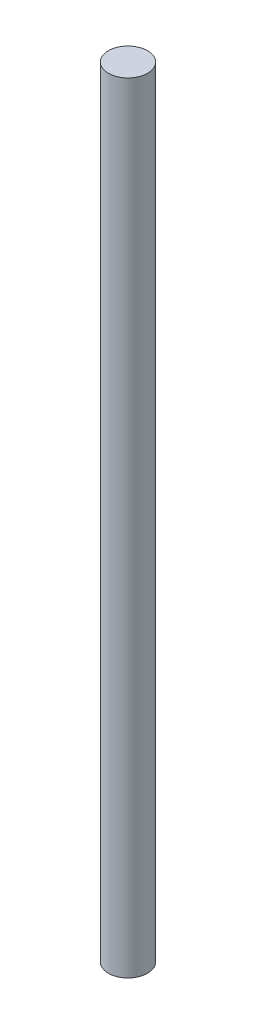
ISO-10303-21;
HEADER;
FILE_DESCRIPTION(('STEP AP214'),'2;1');
FILE_NAME('part.step','',(''),(''),'','','');
FILE_SCHEMA(('AUTOMOTIVE_DESIGN { 1 0 10303 214 1 1 1 1 }'));
ENDSEC;
DATA;
#1=APPLICATION_CONTEXT('core data for automotive mechanical design processes');
#2=APPLICATION_PROTOCOL_DEFINITION('international standard','automotive_design',2000,#1);
#3=PRODUCT_CONTEXT('',#1,'mechanical');
#4=PRODUCT('Part','Part','',(#3));
#5=PRODUCT_RELATED_PRODUCT_CATEGORY('part','',(#4));
#6=PRODUCT_DEFINITION_FORMATION('','',#4);
#7=PRODUCT_DEFINITION_CONTEXT('part definition',#1,'design');
#8=PRODUCT_DEFINITION('design','',#6,#7);
#9=PRODUCT_DEFINITION_SHAPE('','',#8);
#10=(LENGTH_UNIT() NAMED_UNIT(*) SI_UNIT(.MILLI.,.METRE.));
#11=(NAMED_UNIT(*) PLANE_ANGLE_UNIT() SI_UNIT($,.RADIAN.));
#12=(NAMED_UNIT(*) SI_UNIT($,.STERADIAN.) SOLID_ANGLE_UNIT());
#13=UNCERTAINTY_MEASURE_WITH_UNIT(LENGTH_MEASURE(1.E-05),#10,'distance_accuracy_value','');
#14=(GEOMETRIC_REPRESENTATION_CONTEXT(3) GLOBAL_UNCERTAINTY_ASSIGNED_CONTEXT((#13)) GLOBAL_UNIT_ASSIGNED_CONTEXT((#10,
#11,#12)) REPRESENTATION_CONTEXT('',''));
#15=CARTESIAN_POINT('',(0.,0.,0.));
#16=DIRECTION('',(0.,0.,1.));
#17=DIRECTION('',(1.,0.,0.));
#18=AXIS2_PLACEMENT_3D('',#15,#16,#17);
#19=CARTESIAN_POINT('',(0.,59.7,0.));
#20=DIRECTION('',(0.,-1.,0.));
#21=DIRECTION('',(0.,0.,-1.));
#22=AXIS2_PLACEMENT_3D('',#19,#20,#21);
#23=CYLINDRICAL_SURFACE('',#22,1.5);
#24=CARTESIAN_POINT('',(0.,59.7,0.));
#25=DIRECTION('',(0.,1.,0.));
#26=DIRECTION('',(0.,0.,1.));
#27=AXIS2_PLACEMENT_3D('',#24,#25,#26);
#28=CIRCLE('',#27,1.5);
#29=CARTESIAN_POINT('',(0.,59.7,1.5));
#30=VERTEX_POINT('',#29);
#31=EDGE_CURVE('E10',#30,#30,#28,.T.);
#32=ORIENTED_EDGE('',*,*,#31,.F.);
#33=EDGE_LOOP('',(#32));
#34=FACE_BOUND('',#33,.T.);
#35=CARTESIAN_POINT('',(0.,0.,0.));
#36=DIRECTION('',(0.,1.,0.));
#37=DIRECTION('',(0.,0.,1.));
#38=AXIS2_PLACEMENT_3D('',#35,#36,#37);
#39=CIRCLE('',#38,1.5);
#40=CARTESIAN_POINT('',(0.,0.,1.5));
#41=VERTEX_POINT('',#40);
#42=EDGE_CURVE('E33',#41,#41,#39,.T.);
#43=ORIENTED_EDGE('',*,*,#42,.T.);
#44=EDGE_LOOP('',(#43));
#45=FACE_BOUND('',#44,.T.);
#46=ADVANCED_FACE('F30',(#34,#45),#23,.T.);
#47=CARTESIAN_POINT('',(0.,59.7,0.));
#48=DIRECTION('',(0.,1.,0.));
#49=DIRECTION('',(0.,0.,1.));
#50=AXIS2_PLACEMENT_3D('',#47,#48,#49);
#51=PLANE('',#50);
#52=ORIENTED_EDGE('',*,*,#31,.T.);
#53=EDGE_LOOP('',(#52));
#54=FACE_BOUND('',#53,.T.);
#55=ADVANCED_FACE('F45',(#54),#51,.T.);
#56=CARTESIAN_POINT('',(0.,0.,0.));
#57=DIRECTION('',(0.,1.,0.));
#58=DIRECTION('',(0.,0.,1.));
#59=AXIS2_PLACEMENT_3D('',#56,#57,#58);
#60=PLANE('',#59);
#61=ORIENTED_EDGE('',*,*,#42,.F.);
#62=EDGE_LOOP('',(#61));
#63=FACE_BOUND('',#62,.T.);
#64=ADVANCED_FACE('F43',(#63),#60,.F.);
#65=CLOSED_SHELL('',(#46,#55,#64));
#66=MANIFOLD_SOLID_BREP('B2',#65);
#67=ADVANCED_BREP_SHAPE_REPRESENTATION('',(#18,#66),#14);
#68=SHAPE_DEFINITION_REPRESENTATION(#9,#67);
ENDSEC;
END-ISO-10303-21;
